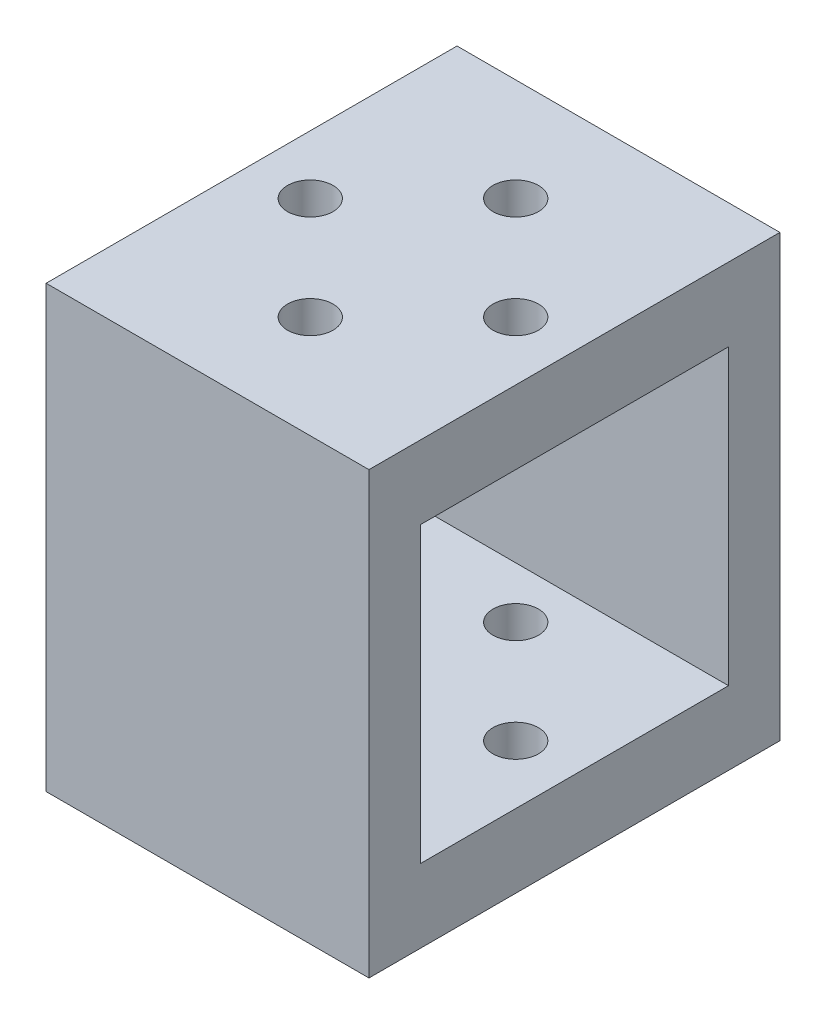
ISO-10303-21;
HEADER;
FILE_DESCRIPTION(('STEP AP214'),'2;1');
FILE_NAME('part.step','',(''),(''),'','','');
FILE_SCHEMA(('AUTOMOTIVE_DESIGN { 1 0 10303 214 1 1 1 1 }'));
ENDSEC;
DATA;
#1=APPLICATION_CONTEXT('core data for automotive mechanical design processes');
#2=APPLICATION_PROTOCOL_DEFINITION('international standard','automotive_design',2000,#1);
#3=PRODUCT_CONTEXT('',#1,'mechanical');
#4=PRODUCT('Part','Part','',(#3));
#5=PRODUCT_RELATED_PRODUCT_CATEGORY('part','',(#4));
#6=PRODUCT_DEFINITION_FORMATION('','',#4);
#7=PRODUCT_DEFINITION_CONTEXT('part definition',#1,'design');
#8=PRODUCT_DEFINITION('design','',#6,#7);
#9=PRODUCT_DEFINITION_SHAPE('','',#8);
#10=(LENGTH_UNIT() NAMED_UNIT(*) SI_UNIT(.MILLI.,.METRE.));
#11=(NAMED_UNIT(*) PLANE_ANGLE_UNIT() SI_UNIT($,.RADIAN.));
#12=(NAMED_UNIT(*) SI_UNIT($,.STERADIAN.) SOLID_ANGLE_UNIT());
#13=UNCERTAINTY_MEASURE_WITH_UNIT(LENGTH_MEASURE(1.E-05),#10,'distance_accuracy_value','');
#14=(GEOMETRIC_REPRESENTATION_CONTEXT(3) GLOBAL_UNCERTAINTY_ASSIGNED_CONTEXT((#13)) GLOBAL_UNIT_ASSIGNED_CONTEXT((#10,
#11,#12)) REPRESENTATION_CONTEXT('',''));
#15=CARTESIAN_POINT('',(0.,0.,0.));
#16=DIRECTION('',(0.,0.,1.));
#17=DIRECTION('',(1.,0.,0.));
#18=AXIS2_PLACEMENT_3D('',#15,#16,#17);
#19=CARTESIAN_POINT('',(0.,5.,0.));
#20=DIRECTION('',(0.,1.,0.));
#21=DIRECTION('',(0.,0.,1.));
#22=AXIS2_PLACEMENT_3D('',#19,#20,#21);
#23=PLANE('',#22);
#24=CARTESIAN_POINT('',(0.,5.,-7.));
#25=DIRECTION('',(0.,1.,0.));
#26=DIRECTION('',(0.,0.,1.));
#27=AXIS2_PLACEMENT_3D('',#24,#25,#26);
#28=CIRCLE('',#27,1.55);
#29=CARTESIAN_POINT('',(0.,5.,-5.45));
#30=VERTEX_POINT('',#29);
#31=EDGE_CURVE('E181',#30,#30,#28,.T.);
#32=ORIENTED_EDGE('',*,*,#31,.F.);
#33=EDGE_LOOP('',(#32));
#34=FACE_BOUND('',#33,.T.);
#35=CARTESIAN_POINT('',(7.,5.,0.));
#36=DIRECTION('',(0.,1.,0.));
#37=DIRECTION('',(0.,0.,1.));
#38=AXIS2_PLACEMENT_3D('',#35,#36,#37);
#39=CIRCLE('',#38,1.55);
#40=CARTESIAN_POINT('',(7.,5.,1.55000000000002));
#41=VERTEX_POINT('',#40);
#42=EDGE_CURVE('E175',#41,#41,#39,.T.);
#43=ORIENTED_EDGE('',*,*,#42,.F.);
#44=EDGE_LOOP('',(#43));
#45=FACE_BOUND('',#44,.T.);
#46=CARTESIAN_POINT('',(3.95332173747447E-13,5.,7.));
#47=DIRECTION('',(0.,1.,0.));
#48=DIRECTION('',(0.,0.,1.));
#49=AXIS2_PLACEMENT_3D('',#46,#47,#48);
#50=CIRCLE('',#49,1.55000000000042);
#51=CARTESIAN_POINT('',(3.95332173747447E-13,5.,8.55000000000043));
#52=VERTEX_POINT('',#51);
#53=EDGE_CURVE('E169',#52,#52,#50,.T.);
#54=ORIENTED_EDGE('',*,*,#53,.F.);
#55=EDGE_LOOP('',(#54));
#56=FACE_BOUND('',#55,.T.);
#57=CARTESIAN_POINT('',(-6.9999999999998,5.,1.98523339633126E-13));
#58=DIRECTION('',(0.,1.,0.));
#59=DIRECTION('',(0.,0.,1.));
#60=AXIS2_PLACEMENT_3D('',#57,#58,#59);
#61=CIRCLE('',#60,1.55000000000032);
#62=CARTESIAN_POINT('',(-6.9999999999998,5.,1.55000000000052));
#63=VERTEX_POINT('',#62);
#64=EDGE_CURVE('E163',#63,#63,#61,.T.);
#65=ORIENTED_EDGE('',*,*,#64,.F.);
#66=EDGE_LOOP('',(#65));
#67=FACE_BOUND('',#66,.T.);
#68=DIRECTION('',(0.,0.,-1.));
#69=VECTOR('',#68,1.);
#70=CARTESIAN_POINT('',(11.,5.,-14.));
#71=LINE('',#70,#69);
#72=CARTESIAN_POINT('',(11.,5.,10.5));
#73=VERTEX_POINT('',#72);
#74=CARTESIAN_POINT('',(11.,5.,-10.5));
#75=VERTEX_POINT('',#74);
#76=EDGE_CURVE('E100',#73,#75,#71,.T.);
#77=ORIENTED_EDGE('',*,*,#76,.T.);
#78=DIRECTION('',(1.,0.,0.));
#79=VECTOR('',#78,1.);
#80=CARTESIAN_POINT('',(11.,5.,-10.5));
#81=LINE('',#80,#79);
#82=CARTESIAN_POINT('',(-11.,5.,-10.5));
#83=VERTEX_POINT('',#82);
#84=EDGE_CURVE('E134',#83,#75,#81,.T.);
#85=ORIENTED_EDGE('',*,*,#84,.F.);
#86=DIRECTION('',(0.,0.,1.));
#87=VECTOR('',#86,1.);
#88=CARTESIAN_POINT('',(-11.,5.,-14.));
#89=LINE('',#88,#87);
#90=CARTESIAN_POINT('',(-11.,5.,10.5));
#91=VERTEX_POINT('',#90);
#92=EDGE_CURVE('E110',#83,#91,#89,.T.);
#93=ORIENTED_EDGE('',*,*,#92,.T.);
#94=DIRECTION('',(-1.,0.,0.));
#95=VECTOR('',#94,1.);
#96=CARTESIAN_POINT('',(11.,5.,10.5));
#97=LINE('',#96,#95);
#98=EDGE_CURVE('E113',#73,#91,#97,.T.);
#99=ORIENTED_EDGE('',*,*,#98,.F.);
#100=EDGE_LOOP('',(#77,#85,#93,#99));
#101=FACE_BOUND('',#100,.T.);
#102=ADVANCED_FACE('F34',(#34,#45,#56,#67,#101),#23,.T.);
#103=CARTESIAN_POINT('',(11.,5.,-14.));
#104=DIRECTION('',(-1.,0.,0.));
#105=DIRECTION('',(0.,0.,1.));
#106=AXIS2_PLACEMENT_3D('',#103,#104,#105);
#107=PLANE('',#106);
#108=DIRECTION('',(0.,-1.,0.));
#109=VECTOR('',#108,1.);
#110=CARTESIAN_POINT('',(11.,5.,10.5));
#111=LINE('',#110,#109);
#112=CARTESIAN_POINT('',(11.,25.,10.5));
#113=VERTEX_POINT('',#112);
#114=EDGE_CURVE('E104',#113,#73,#111,.T.);
#115=ORIENTED_EDGE('',*,*,#114,.F.);
#116=DIRECTION('',(0.,0.,-1.));
#117=VECTOR('',#116,1.);
#118=CARTESIAN_POINT('',(11.,25.,-14.));
#119=LINE('',#118,#117);
#120=CARTESIAN_POINT('',(11.,25.,-10.5));
#121=VERTEX_POINT('',#120);
#122=EDGE_CURVE('E184',#113,#121,#119,.T.);
#123=ORIENTED_EDGE('',*,*,#122,.T.);
#124=DIRECTION('',(0.,1.,0.));
#125=VECTOR('',#124,1.);
#126=CARTESIAN_POINT('',(11.,5.,-10.5));
#127=LINE('',#126,#125);
#128=EDGE_CURVE('E106',#75,#121,#127,.T.);
#129=ORIENTED_EDGE('',*,*,#128,.F.);
#130=ORIENTED_EDGE('',*,*,#76,.F.);
#131=EDGE_LOOP('',(#115,#123,#129,#130));
#132=FACE_BOUND('',#131,.T.);
#133=DIRECTION('',(0.,0.,-1.));
#134=VECTOR('',#133,1.);
#135=CARTESIAN_POINT('',(11.,0.,-14.));
#136=LINE('',#135,#134);
#137=CARTESIAN_POINT('',(11.,0.,14.));
#138=VERTEX_POINT('',#137);
#139=CARTESIAN_POINT('',(11.,0.,-14.));
#140=VERTEX_POINT('',#139);
#141=EDGE_CURVE('E198',#138,#140,#136,.T.);
#142=ORIENTED_EDGE('',*,*,#141,.T.);
#143=DIRECTION('',(0.,-1.,0.));
#144=VECTOR('',#143,1.);
#145=CARTESIAN_POINT('',(11.,5.,-14.));
#146=LINE('',#145,#144);
#147=CARTESIAN_POINT('',(11.,30.,-14.));
#148=VERTEX_POINT('',#147);
#149=EDGE_CURVE('E11',#148,#140,#146,.T.);
#150=ORIENTED_EDGE('',*,*,#149,.F.);
#151=DIRECTION('',(0.,0.,-1.));
#152=VECTOR('',#151,1.);
#153=CARTESIAN_POINT('',(11.,30.,-14.));
#154=LINE('',#153,#152);
#155=CARTESIAN_POINT('',(11.,30.,14.));
#156=VERTEX_POINT('',#155);
#157=EDGE_CURVE('E185',#156,#148,#154,.T.);
#158=ORIENTED_EDGE('',*,*,#157,.F.);
#159=DIRECTION('',(0.,-1.,0.));
#160=VECTOR('',#159,1.);
#161=CARTESIAN_POINT('',(11.,5.,14.));
#162=LINE('',#161,#160);
#163=EDGE_CURVE('E202',#156,#138,#162,.T.);
#164=ORIENTED_EDGE('',*,*,#163,.T.);
#165=EDGE_LOOP('',(#142,#150,#158,#164));
#166=FACE_BOUND('',#165,.T.);
#167=ADVANCED_FACE('F36',(#132,#166),#107,.F.);
#168=CARTESIAN_POINT('',(-11.,5.,-14.));
#169=DIRECTION('',(0.,0.,1.));
#170=DIRECTION('',(1.,0.,0.));
#171=AXIS2_PLACEMENT_3D('',#168,#169,#170);
#172=PLANE('',#171);
#173=DIRECTION('',(-1.,0.,0.));
#174=VECTOR('',#173,1.);
#175=CARTESIAN_POINT('',(-11.,0.,-14.));
#176=LINE('',#175,#174);
#177=CARTESIAN_POINT('',(-11.,0.,-14.));
#178=VERTEX_POINT('',#177);
#179=EDGE_CURVE('E205',#140,#178,#176,.T.);
#180=ORIENTED_EDGE('',*,*,#179,.T.);
#181=DIRECTION('',(0.,-1.,0.));
#182=VECTOR('',#181,1.);
#183=CARTESIAN_POINT('',(-11.,5.,-14.));
#184=LINE('',#183,#182);
#185=CARTESIAN_POINT('',(-11.,30.,-14.));
#186=VERTEX_POINT('',#185);
#187=EDGE_CURVE('E42',#186,#178,#184,.T.);
#188=ORIENTED_EDGE('',*,*,#187,.F.);
#189=DIRECTION('',(-1.,0.,0.));
#190=VECTOR('',#189,1.);
#191=CARTESIAN_POINT('',(-11.,30.,-14.));
#192=LINE('',#191,#190);
#193=EDGE_CURVE('E188',#148,#186,#192,.T.);
#194=ORIENTED_EDGE('',*,*,#193,.F.);
#195=ORIENTED_EDGE('',*,*,#149,.T.);
#196=EDGE_LOOP('',(#180,#188,#194,#195));
#197=FACE_BOUND('',#196,.T.);
#198=ADVANCED_FACE('F223',(#197),#172,.F.);
#199=CARTESIAN_POINT('',(-11.,5.,-14.));
#200=DIRECTION('',(1.,0.,0.));
#201=DIRECTION('',(0.,0.,-1.));
#202=AXIS2_PLACEMENT_3D('',#199,#200,#201);
#203=PLANE('',#202);
#204=DIRECTION('',(0.,0.,1.));
#205=VECTOR('',#204,1.);
#206=CARTESIAN_POINT('',(-11.,25.,-14.));
#207=LINE('',#206,#205);
#208=CARTESIAN_POINT('',(-11.,25.,-10.5));
#209=VERTEX_POINT('',#208);
#210=CARTESIAN_POINT('',(-11.,25.,10.5));
#211=VERTEX_POINT('',#210);
#212=EDGE_CURVE('E189',#209,#211,#207,.T.);
#213=ORIENTED_EDGE('',*,*,#212,.T.);
#214=DIRECTION('',(0.,1.,0.));
#215=VECTOR('',#214,1.);
#216=CARTESIAN_POINT('',(-11.,5.,10.5));
#217=LINE('',#216,#215);
#218=EDGE_CURVE('E117',#91,#211,#217,.T.);
#219=ORIENTED_EDGE('',*,*,#218,.F.);
#220=ORIENTED_EDGE('',*,*,#92,.F.);
#221=DIRECTION('',(0.,-1.,0.));
#222=VECTOR('',#221,1.);
#223=CARTESIAN_POINT('',(-11.,5.,-10.5));
#224=LINE('',#223,#222);
#225=EDGE_CURVE('E131',#209,#83,#224,.T.);
#226=ORIENTED_EDGE('',*,*,#225,.F.);
#227=EDGE_LOOP('',(#213,#219,#220,#226));
#228=FACE_BOUND('',#227,.T.);
#229=DIRECTION('',(0.,-1.,0.));
#230=VECTOR('',#229,1.);
#231=CARTESIAN_POINT('',(-11.,5.,14.));
#232=LINE('',#231,#230);
#233=CARTESIAN_POINT('',(-11.,30.,14.));
#234=VERTEX_POINT('',#233);
#235=CARTESIAN_POINT('',(-11.,0.,14.));
#236=VERTEX_POINT('',#235);
#237=EDGE_CURVE('E210',#234,#236,#232,.T.);
#238=ORIENTED_EDGE('',*,*,#237,.F.);
#239=DIRECTION('',(0.,0.,1.));
#240=VECTOR('',#239,1.);
#241=CARTESIAN_POINT('',(-11.,30.,-14.));
#242=LINE('',#241,#240);
#243=EDGE_CURVE('E192',#186,#234,#242,.T.);
#244=ORIENTED_EDGE('',*,*,#243,.F.);
#245=ORIENTED_EDGE('',*,*,#187,.T.);
#246=DIRECTION('',(0.,0.,1.));
#247=VECTOR('',#246,1.);
#248=CARTESIAN_POINT('',(-11.,0.,-14.));
#249=LINE('',#248,#247);
#250=EDGE_CURVE('E57',#178,#236,#249,.T.);
#251=ORIENTED_EDGE('',*,*,#250,.T.);
#252=EDGE_LOOP('',(#238,#244,#245,#251));
#253=FACE_BOUND('',#252,.T.);
#254=ADVANCED_FACE('F212',(#228,#253),#203,.F.);
#255=CARTESIAN_POINT('',(-11.,5.,14.));
#256=DIRECTION('',(0.,0.,-1.));
#257=DIRECTION('',(-1.,0.,0.));
#258=AXIS2_PLACEMENT_3D('',#255,#256,#257);
#259=PLANE('',#258);
#260=DIRECTION('',(1.,0.,0.));
#261=VECTOR('',#260,1.);
#262=CARTESIAN_POINT('',(-11.,0.,14.));
#263=LINE('',#262,#261);
#264=EDGE_CURVE('E49',#236,#138,#263,.T.);
#265=ORIENTED_EDGE('',*,*,#264,.T.);
#266=ORIENTED_EDGE('',*,*,#163,.F.);
#267=DIRECTION('',(1.,0.,0.));
#268=VECTOR('',#267,1.);
#269=CARTESIAN_POINT('',(-11.,30.,14.));
#270=LINE('',#269,#268);
#271=EDGE_CURVE('E195',#234,#156,#270,.T.);
#272=ORIENTED_EDGE('',*,*,#271,.F.);
#273=ORIENTED_EDGE('',*,*,#237,.T.);
#274=EDGE_LOOP('',(#265,#266,#272,#273));
#275=FACE_BOUND('',#274,.T.);
#276=ADVANCED_FACE('F220',(#275),#259,.F.);
#277=CARTESIAN_POINT('',(0.,0.,0.));
#278=DIRECTION('',(0.,1.,0.));
#279=DIRECTION('',(0.,0.,1.));
#280=AXIS2_PLACEMENT_3D('',#277,#278,#279);
#281=PLANE('',#280);
#282=CARTESIAN_POINT('',(0.,0.,-7.));
#283=DIRECTION('',(0.,1.,0.));
#284=DIRECTION('',(0.,0.,1.));
#285=AXIS2_PLACEMENT_3D('',#282,#283,#284);
#286=CIRCLE('',#285,1.55);
#287=CARTESIAN_POINT('',(0.,0.,-5.45));
#288=VERTEX_POINT('',#287);
#289=EDGE_CURVE('E137',#288,#288,#286,.T.);
#290=ORIENTED_EDGE('',*,*,#289,.T.);
#291=EDGE_LOOP('',(#290));
#292=FACE_BOUND('',#291,.T.);
#293=CARTESIAN_POINT('',(7.,0.,0.));
#294=DIRECTION('',(0.,1.,0.));
#295=DIRECTION('',(0.,0.,1.));
#296=AXIS2_PLACEMENT_3D('',#293,#294,#295);
#297=CIRCLE('',#296,1.55);
#298=CARTESIAN_POINT('',(7.,0.,1.55000000000002));
#299=VERTEX_POINT('',#298);
#300=EDGE_CURVE('E144',#299,#299,#297,.T.);
#301=ORIENTED_EDGE('',*,*,#300,.T.);
#302=EDGE_LOOP('',(#301));
#303=FACE_BOUND('',#302,.T.);
#304=CARTESIAN_POINT('',(3.95332173747447E-13,0.,7.));
#305=DIRECTION('',(0.,1.,0.));
#306=DIRECTION('',(0.,0.,1.));
#307=AXIS2_PLACEMENT_3D('',#304,#305,#306);
#308=CIRCLE('',#307,1.55000000000042);
#309=CARTESIAN_POINT('',(3.95332173747447E-13,0.,8.55000000000043));
#310=VERTEX_POINT('',#309);
#311=EDGE_CURVE('E150',#310,#310,#308,.T.);
#312=ORIENTED_EDGE('',*,*,#311,.T.);
#313=EDGE_LOOP('',(#312));
#314=FACE_BOUND('',#313,.T.);
#315=CARTESIAN_POINT('',(-6.9999999999998,0.,1.98523339633126E-13));
#316=DIRECTION('',(0.,1.,0.));
#317=DIRECTION('',(0.,0.,1.));
#318=AXIS2_PLACEMENT_3D('',#315,#316,#317);
#319=CIRCLE('',#318,1.55000000000032);
#320=CARTESIAN_POINT('',(-6.9999999999998,0.,1.55000000000052));
#321=VERTEX_POINT('',#320);
#322=EDGE_CURVE('E156',#321,#321,#319,.T.);
#323=ORIENTED_EDGE('',*,*,#322,.T.);
#324=EDGE_LOOP('',(#323));
#325=FACE_BOUND('',#324,.T.);
#326=ORIENTED_EDGE('',*,*,#141,.F.);
#327=ORIENTED_EDGE('',*,*,#264,.F.);
#328=ORIENTED_EDGE('',*,*,#250,.F.);
#329=ORIENTED_EDGE('',*,*,#179,.F.);
#330=EDGE_LOOP('',(#326,#327,#328,#329));
#331=FACE_BOUND('',#330,.T.);
#332=ADVANCED_FACE('F217',(#292,#303,#314,#325,#331),#281,.F.);
#333=CARTESIAN_POINT('',(0.,25.,0.));
#334=DIRECTION('',(0.,1.,0.));
#335=DIRECTION('',(0.,0.,1.));
#336=AXIS2_PLACEMENT_3D('',#333,#334,#335);
#337=PLANE('',#336);
#338=CARTESIAN_POINT('',(0.,25.,-7.));
#339=DIRECTION('',(0.,1.,0.));
#340=DIRECTION('',(0.,0.,1.));
#341=AXIS2_PLACEMENT_3D('',#338,#339,#340);
#342=CIRCLE('',#341,1.55);
#343=CARTESIAN_POINT('',(0.,25.,-5.45));
#344=VERTEX_POINT('',#343);
#345=EDGE_CURVE('E178',#344,#344,#342,.T.);
#346=ORIENTED_EDGE('',*,*,#345,.T.);
#347=EDGE_LOOP('',(#346));
#348=FACE_BOUND('',#347,.T.);
#349=CARTESIAN_POINT('',(7.,25.,0.));
#350=DIRECTION('',(0.,1.,0.));
#351=DIRECTION('',(0.,0.,1.));
#352=AXIS2_PLACEMENT_3D('',#349,#350,#351);
#353=CIRCLE('',#352,1.55);
#354=CARTESIAN_POINT('',(7.,25.,1.55000000000002));
#355=VERTEX_POINT('',#354);
#356=EDGE_CURVE('E172',#355,#355,#353,.T.);
#357=ORIENTED_EDGE('',*,*,#356,.T.);
#358=EDGE_LOOP('',(#357));
#359=FACE_BOUND('',#358,.T.);
#360=CARTESIAN_POINT('',(3.95332173747447E-13,25.,7.));
#361=DIRECTION('',(0.,1.,0.));
#362=DIRECTION('',(0.,0.,1.));
#363=AXIS2_PLACEMENT_3D('',#360,#361,#362);
#364=CIRCLE('',#363,1.55000000000042);
#365=CARTESIAN_POINT('',(3.95332173747447E-13,25.,8.55000000000043));
#366=VERTEX_POINT('',#365);
#367=EDGE_CURVE('E166',#366,#366,#364,.T.);
#368=ORIENTED_EDGE('',*,*,#367,.T.);
#369=EDGE_LOOP('',(#368));
#370=FACE_BOUND('',#369,.T.);
#371=CARTESIAN_POINT('',(-6.9999999999998,25.,1.98523339633126E-13));
#372=DIRECTION('',(0.,1.,0.));
#373=DIRECTION('',(0.,0.,1.));
#374=AXIS2_PLACEMENT_3D('',#371,#372,#373);
#375=CIRCLE('',#374,1.55000000000032);
#376=CARTESIAN_POINT('',(-6.9999999999998,25.,1.55000000000052));
#377=VERTEX_POINT('',#376);
#378=EDGE_CURVE('E140',#377,#377,#375,.T.);
#379=ORIENTED_EDGE('',*,*,#378,.T.);
#380=EDGE_LOOP('',(#379));
#381=FACE_BOUND('',#380,.T.);
#382=ORIENTED_EDGE('',*,*,#122,.F.);
#383=DIRECTION('',(1.,0.,0.));
#384=VECTOR('',#383,1.);
#385=CARTESIAN_POINT('',(11.,25.,10.5));
#386=LINE('',#385,#384);
#387=EDGE_CURVE('E122',#211,#113,#386,.T.);
#388=ORIENTED_EDGE('',*,*,#387,.F.);
#389=ORIENTED_EDGE('',*,*,#212,.F.);
#390=DIRECTION('',(-1.,0.,0.));
#391=VECTOR('',#390,1.);
#392=CARTESIAN_POINT('',(11.,25.,-10.5));
#393=LINE('',#392,#391);
#394=EDGE_CURVE('E128',#121,#209,#393,.T.);
#395=ORIENTED_EDGE('',*,*,#394,.F.);
#396=EDGE_LOOP('',(#382,#388,#389,#395));
#397=FACE_BOUND('',#396,.T.);
#398=ADVANCED_FACE('F240',(#348,#359,#370,#381,#397),#337,.F.);
#399=CARTESIAN_POINT('',(0.,30.,0.));
#400=DIRECTION('',(0.,1.,0.));
#401=DIRECTION('',(0.,0.,1.));
#402=AXIS2_PLACEMENT_3D('',#399,#400,#401);
#403=PLANE('',#402);
#404=CARTESIAN_POINT('',(0.,30.,-7.));
#405=DIRECTION('',(0.,1.,0.));
#406=DIRECTION('',(0.,0.,1.));
#407=AXIS2_PLACEMENT_3D('',#404,#405,#406);
#408=CIRCLE('',#407,1.55);
#409=CARTESIAN_POINT('',(0.,30.,-5.45));
#410=VERTEX_POINT('',#409);
#411=EDGE_CURVE('E141',#410,#410,#408,.T.);
#412=ORIENTED_EDGE('',*,*,#411,.F.);
#413=EDGE_LOOP('',(#412));
#414=FACE_BOUND('',#413,.T.);
#415=CARTESIAN_POINT('',(7.,30.,0.));
#416=DIRECTION('',(0.,1.,0.));
#417=DIRECTION('',(0.,0.,1.));
#418=AXIS2_PLACEMENT_3D('',#415,#416,#417);
#419=CIRCLE('',#418,1.55);
#420=CARTESIAN_POINT('',(7.,30.,1.55000000000002));
#421=VERTEX_POINT('',#420);
#422=EDGE_CURVE('E147',#421,#421,#419,.T.);
#423=ORIENTED_EDGE('',*,*,#422,.F.);
#424=EDGE_LOOP('',(#423));
#425=FACE_BOUND('',#424,.T.);
#426=CARTESIAN_POINT('',(3.95332173747447E-13,30.,7.));
#427=DIRECTION('',(0.,1.,0.));
#428=DIRECTION('',(0.,0.,1.));
#429=AXIS2_PLACEMENT_3D('',#426,#427,#428);
#430=CIRCLE('',#429,1.55000000000042);
#431=CARTESIAN_POINT('',(3.95332173747447E-13,30.,8.55000000000043));
#432=VERTEX_POINT('',#431);
#433=EDGE_CURVE('E153',#432,#432,#430,.T.);
#434=ORIENTED_EDGE('',*,*,#433,.F.);
#435=EDGE_LOOP('',(#434));
#436=FACE_BOUND('',#435,.T.);
#437=CARTESIAN_POINT('',(-6.9999999999998,30.,1.98523339633126E-13));
#438=DIRECTION('',(0.,1.,0.));
#439=DIRECTION('',(0.,0.,1.));
#440=AXIS2_PLACEMENT_3D('',#437,#438,#439);
#441=CIRCLE('',#440,1.55000000000032);
#442=CARTESIAN_POINT('',(-6.9999999999998,30.,1.55000000000052));
#443=VERTEX_POINT('',#442);
#444=EDGE_CURVE('E136',#443,#443,#441,.T.);
#445=ORIENTED_EDGE('',*,*,#444,.F.);
#446=EDGE_LOOP('',(#445));
#447=FACE_BOUND('',#446,.T.);
#448=ORIENTED_EDGE('',*,*,#157,.T.);
#449=ORIENTED_EDGE('',*,*,#193,.T.);
#450=ORIENTED_EDGE('',*,*,#243,.T.);
#451=ORIENTED_EDGE('',*,*,#271,.T.);
#452=EDGE_LOOP('',(#448,#449,#450,#451));
#453=FACE_BOUND('',#452,.T.);
#454=ADVANCED_FACE('F222',(#414,#425,#436,#447,#453),#403,.T.);
#455=CARTESIAN_POINT('',(-6.9999999999998,0.,1.98523339633126E-13));
#456=DIRECTION('',(0.,1.,0.));
#457=DIRECTION('',(0.,0.,1.));
#458=AXIS2_PLACEMENT_3D('',#455,#456,#457);
#459=CYLINDRICAL_SURFACE('',#458,1.55000000000032);
#460=ORIENTED_EDGE('',*,*,#444,.T.);
#461=EDGE_LOOP('',(#460));
#462=FACE_BOUND('',#461,.T.);
#463=ORIENTED_EDGE('',*,*,#378,.F.);
#464=EDGE_LOOP('',(#463));
#465=FACE_BOUND('',#464,.T.);
#466=ADVANCED_FACE('F267',(#462,#465),#459,.F.);
#467=CARTESIAN_POINT('',(3.95332173747447E-13,0.,7.));
#468=DIRECTION('',(0.,1.,0.));
#469=DIRECTION('',(0.,0.,1.));
#470=AXIS2_PLACEMENT_3D('',#467,#468,#469);
#471=CYLINDRICAL_SURFACE('',#470,1.55000000000042);
#472=ORIENTED_EDGE('',*,*,#433,.T.);
#473=EDGE_LOOP('',(#472));
#474=FACE_BOUND('',#473,.T.);
#475=ORIENTED_EDGE('',*,*,#367,.F.);
#476=EDGE_LOOP('',(#475));
#477=FACE_BOUND('',#476,.T.);
#478=ADVANCED_FACE('F274',(#474,#477),#471,.F.);
#479=CARTESIAN_POINT('',(7.,0.,0.));
#480=DIRECTION('',(0.,1.,0.));
#481=DIRECTION('',(0.,0.,1.));
#482=AXIS2_PLACEMENT_3D('',#479,#480,#481);
#483=CYLINDRICAL_SURFACE('',#482,1.55);
#484=ORIENTED_EDGE('',*,*,#422,.T.);
#485=EDGE_LOOP('',(#484));
#486=FACE_BOUND('',#485,.T.);
#487=ORIENTED_EDGE('',*,*,#356,.F.);
#488=EDGE_LOOP('',(#487));
#489=FACE_BOUND('',#488,.T.);
#490=ADVANCED_FACE('F283',(#486,#489),#483,.F.);
#491=CARTESIAN_POINT('',(0.,0.,-7.));
#492=DIRECTION('',(0.,1.,0.));
#493=DIRECTION('',(0.,0.,1.));
#494=AXIS2_PLACEMENT_3D('',#491,#492,#493);
#495=CYLINDRICAL_SURFACE('',#494,1.55);
#496=ORIENTED_EDGE('',*,*,#411,.T.);
#497=EDGE_LOOP('',(#496));
#498=FACE_BOUND('',#497,.T.);
#499=ORIENTED_EDGE('',*,*,#345,.F.);
#500=EDGE_LOOP('',(#499));
#501=FACE_BOUND('',#500,.T.);
#502=ADVANCED_FACE('F292',(#498,#501),#495,.F.);
#503=ORIENTED_EDGE('',*,*,#64,.T.);
#504=EDGE_LOOP('',(#503));
#505=FACE_BOUND('',#504,.T.);
#506=ORIENTED_EDGE('',*,*,#322,.F.);
#507=EDGE_LOOP('',(#506));
#508=FACE_BOUND('',#507,.T.);
#509=ADVANCED_FACE('F277',(#505,#508),#459,.F.);
#510=ORIENTED_EDGE('',*,*,#53,.T.);
#511=EDGE_LOOP('',(#510));
#512=FACE_BOUND('',#511,.T.);
#513=ORIENTED_EDGE('',*,*,#311,.F.);
#514=EDGE_LOOP('',(#513));
#515=FACE_BOUND('',#514,.T.);
#516=ADVANCED_FACE('F286',(#512,#515),#471,.F.);
#517=ORIENTED_EDGE('',*,*,#42,.T.);
#518=EDGE_LOOP('',(#517));
#519=FACE_BOUND('',#518,.T.);
#520=ORIENTED_EDGE('',*,*,#300,.F.);
#521=EDGE_LOOP('',(#520));
#522=FACE_BOUND('',#521,.T.);
#523=ADVANCED_FACE('F295',(#519,#522),#483,.F.);
#524=ORIENTED_EDGE('',*,*,#31,.T.);
#525=EDGE_LOOP('',(#524));
#526=FACE_BOUND('',#525,.T.);
#527=ORIENTED_EDGE('',*,*,#289,.F.);
#528=EDGE_LOOP('',(#527));
#529=FACE_BOUND('',#528,.T.);
#530=ADVANCED_FACE('F303',(#526,#529),#495,.F.);
#531=CARTESIAN_POINT('',(0.,0.,-10.5));
#532=DIRECTION('',(0.,0.,1.));
#533=DIRECTION('',(1.,0.,0.));
#534=AXIS2_PLACEMENT_3D('',#531,#532,#533);
#535=PLANE('',#534);
#536=ORIENTED_EDGE('',*,*,#128,.T.);
#537=ORIENTED_EDGE('',*,*,#394,.T.);
#538=ORIENTED_EDGE('',*,*,#225,.T.);
#539=ORIENTED_EDGE('',*,*,#84,.T.);
#540=EDGE_LOOP('',(#536,#537,#538,#539));
#541=FACE_BOUND('',#540,.T.);
#542=ADVANCED_FACE('F327',(#541),#535,.T.);
#543=CARTESIAN_POINT('',(0.,0.,10.5));
#544=DIRECTION('',(0.,0.,1.));
#545=DIRECTION('',(1.,0.,0.));
#546=AXIS2_PLACEMENT_3D('',#543,#544,#545);
#547=PLANE('',#546);
#548=ORIENTED_EDGE('',*,*,#114,.T.);
#549=ORIENTED_EDGE('',*,*,#98,.T.);
#550=ORIENTED_EDGE('',*,*,#218,.T.);
#551=ORIENTED_EDGE('',*,*,#387,.T.);
#552=EDGE_LOOP('',(#548,#549,#550,#551));
#553=FACE_BOUND('',#552,.T.);
#554=ADVANCED_FACE('F120',(#553),#547,.F.);
#555=CLOSED_SHELL('',(#102,#167,#198,#254,#276,#332,#398,#454,#466,#478,#490,#502,#509,#516,
#523,#530,#542,#554));
#556=MANIFOLD_SOLID_BREP('B2',#555);
#557=ADVANCED_BREP_SHAPE_REPRESENTATION('',(#18,#556),#14);
#558=SHAPE_DEFINITION_REPRESENTATION(#9,#557);
ENDSEC;
END-ISO-10303-21;
